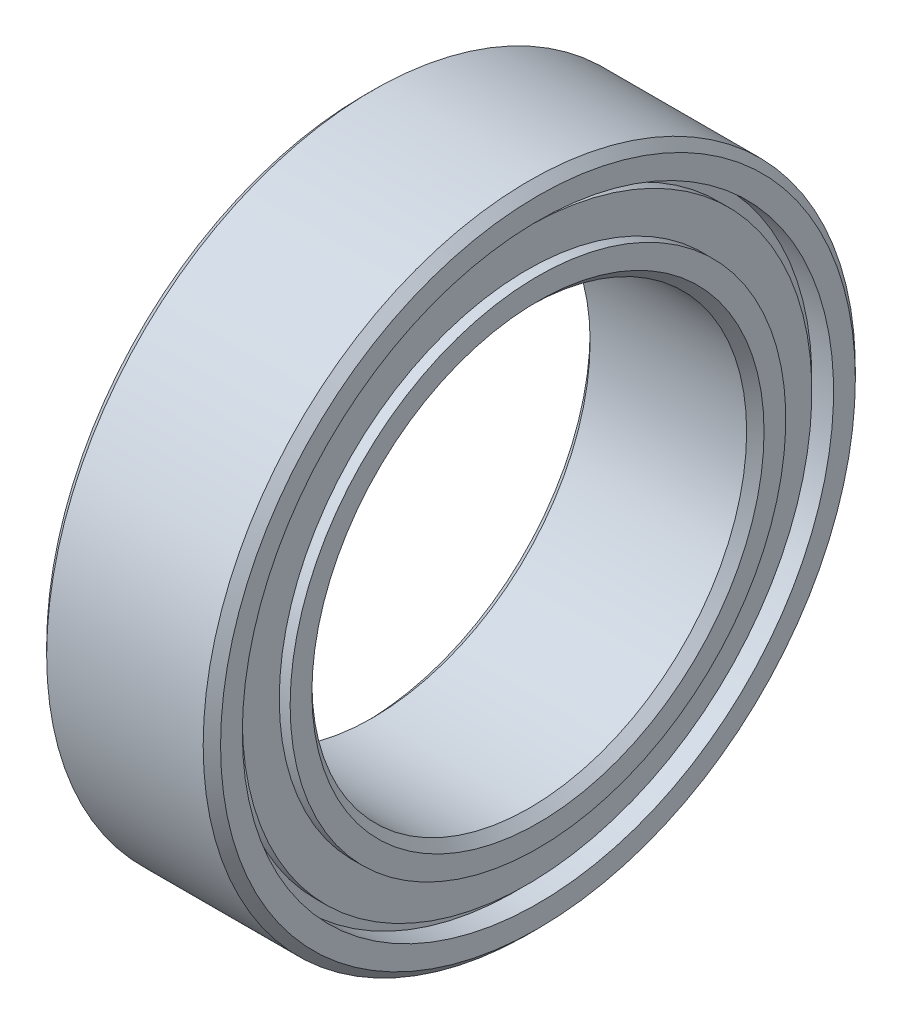
ISO-10303-21;
HEADER;
FILE_DESCRIPTION(('STEP AP214'),'2;1');
FILE_NAME('part.step','',(''),(''),'','','');
FILE_SCHEMA(('AUTOMOTIVE_DESIGN { 1 0 10303 214 1 1 1 1 }'));
ENDSEC;
DATA;
#1=APPLICATION_CONTEXT('core data for automotive mechanical design processes');
#2=APPLICATION_PROTOCOL_DEFINITION('international standard','automotive_design',2000,#1);
#3=PRODUCT_CONTEXT('',#1,'mechanical');
#4=PRODUCT('Part','Part','',(#3));
#5=PRODUCT_RELATED_PRODUCT_CATEGORY('part','',(#4));
#6=PRODUCT_DEFINITION_FORMATION('','',#4);
#7=PRODUCT_DEFINITION_CONTEXT('part definition',#1,'design');
#8=PRODUCT_DEFINITION('design','',#6,#7);
#9=PRODUCT_DEFINITION_SHAPE('','',#8);
#10=(LENGTH_UNIT() NAMED_UNIT(*) SI_UNIT(.MILLI.,.METRE.));
#11=(NAMED_UNIT(*) PLANE_ANGLE_UNIT() SI_UNIT($,.RADIAN.));
#12=(NAMED_UNIT(*) SI_UNIT($,.STERADIAN.) SOLID_ANGLE_UNIT());
#13=UNCERTAINTY_MEASURE_WITH_UNIT(LENGTH_MEASURE(1.E-05),#10,'distance_accuracy_value','');
#14=(GEOMETRIC_REPRESENTATION_CONTEXT(3) GLOBAL_UNCERTAINTY_ASSIGNED_CONTEXT((#13)) GLOBAL_UNIT_ASSIGNED_CONTEXT((#10,
#11,#12)) REPRESENTATION_CONTEXT('',''));
#15=CARTESIAN_POINT('',(0.,0.,0.));
#16=DIRECTION('',(0.,0.,1.));
#17=DIRECTION('',(1.,0.,0.));
#18=AXIS2_PLACEMENT_3D('',#15,#16,#17);
#19=CARTESIAN_POINT('',(-2.,6.8,0.));
#20=DIRECTION('',(1.,0.,0.));
#21=DIRECTION('',(0.,0.,-1.));
#22=AXIS2_PLACEMENT_3D('',#19,#20,#21);
#23=PLANE('',#22);
#24=CARTESIAN_POINT('',(-2.,0.,0.));
#25=DIRECTION('',(1.,0.,0.));
#26=DIRECTION('',(0.,0.,-1.));
#27=AXIS2_PLACEMENT_3D('',#24,#25,#26);
#28=CIRCLE('',#27,7.3);
#29=CARTESIAN_POINT('',(-2.,0.,-7.3));
#30=VERTEX_POINT('',#29);
#31=EDGE_CURVE('E10',#30,#30,#28,.F.);
#32=ORIENTED_EDGE('',*,*,#31,.T.);
#33=EDGE_LOOP('',(#32));
#34=FACE_BOUND('',#33,.T.);
#35=CARTESIAN_POINT('',(-2.,0.,0.));
#36=DIRECTION('',(-1.,0.,0.));
#37=DIRECTION('',(0.,0.,1.));
#38=AXIS2_PLACEMENT_3D('',#35,#36,#37);
#39=CIRCLE('',#38,6.8);
#40=CARTESIAN_POINT('',(-2.,0.,6.8));
#41=VERTEX_POINT('',#40);
#42=EDGE_CURVE('E68',#41,#41,#39,.T.);
#43=ORIENTED_EDGE('',*,*,#42,.F.);
#44=EDGE_LOOP('',(#43));
#45=FACE_BOUND('',#44,.T.);
#46=ADVANCED_FACE('F35',(#34,#45),#23,.F.);
#47=CARTESIAN_POINT('',(-3.90102380964335,0.,0.));
#48=DIRECTION('',(-1.,0.,0.));
#49=DIRECTION('',(0.,0.,1.));
#50=AXIS2_PLACEMENT_3D('',#47,#48,#49);
#51=CYLINDRICAL_SURFACE('',#50,6.8);
#52=CARTESIAN_POINT('',(-1.5,0.,0.));
#53=DIRECTION('',(-1.,0.,0.));
#54=DIRECTION('',(0.,0.,1.));
#55=AXIS2_PLACEMENT_3D('',#52,#53,#54);
#56=CIRCLE('',#55,6.8);
#57=CARTESIAN_POINT('',(-1.5,0.,6.8));
#58=VERTEX_POINT('',#57);
#59=EDGE_CURVE('E71',#58,#58,#56,.T.);
#60=ORIENTED_EDGE('',*,*,#59,.F.);
#61=EDGE_LOOP('',(#60));
#62=FACE_BOUND('',#61,.T.);
#63=ORIENTED_EDGE('',*,*,#42,.T.);
#64=EDGE_LOOP('',(#63));
#65=FACE_BOUND('',#64,.T.);
#66=ADVANCED_FACE('F149',(#62,#65),#51,.F.);
#67=CARTESIAN_POINT('',(-1.5,6.55,0.));
#68=DIRECTION('',(1.,0.,0.));
#69=DIRECTION('',(0.,0.,-1.));
#70=AXIS2_PLACEMENT_3D('',#67,#68,#69);
#71=PLANE('',#70);
#72=CARTESIAN_POINT('',(-1.5,0.,0.));
#73=DIRECTION('',(-1.,0.,0.));
#74=DIRECTION('',(0.,0.,1.));
#75=AXIS2_PLACEMENT_3D('',#72,#73,#74);
#76=CIRCLE('',#75,6.55);
#77=CARTESIAN_POINT('',(-1.5,0.,6.55));
#78=VERTEX_POINT('',#77);
#79=EDGE_CURVE('E74',#78,#78,#76,.T.);
#80=ORIENTED_EDGE('',*,*,#79,.F.);
#81=EDGE_LOOP('',(#80));
#82=FACE_BOUND('',#81,.T.);
#83=ORIENTED_EDGE('',*,*,#59,.T.);
#84=EDGE_LOOP('',(#83));
#85=FACE_BOUND('',#84,.T.);
#86=ADVANCED_FACE('F154',(#82,#85),#71,.F.);
#87=CARTESIAN_POINT('',(-3.90102380964335,0.,0.));
#88=DIRECTION('',(-1.,0.,0.));
#89=DIRECTION('',(0.,0.,1.));
#90=AXIS2_PLACEMENT_3D('',#87,#88,#89);
#91=CYLINDRICAL_SURFACE('',#90,6.55);
#92=CARTESIAN_POINT('',(-1.75,0.,0.));
#93=DIRECTION('',(-1.,0.,0.));
#94=DIRECTION('',(0.,0.,1.));
#95=AXIS2_PLACEMENT_3D('',#92,#93,#94);
#96=CIRCLE('',#95,6.55);
#97=CARTESIAN_POINT('',(-1.75,0.,6.55));
#98=VERTEX_POINT('',#97);
#99=EDGE_CURVE('E77',#98,#98,#96,.T.);
#100=ORIENTED_EDGE('',*,*,#99,.F.);
#101=EDGE_LOOP('',(#100));
#102=FACE_BOUND('',#101,.T.);
#103=ORIENTED_EDGE('',*,*,#79,.T.);
#104=EDGE_LOOP('',(#103));
#105=FACE_BOUND('',#104,.T.);
#106=ADVANCED_FACE('F241',(#102,#105),#91,.T.);
#107=CARTESIAN_POINT('',(-1.75,5.7,0.));
#108=DIRECTION('',(1.,0.,0.));
#109=DIRECTION('',(0.,0.,-1.));
#110=AXIS2_PLACEMENT_3D('',#107,#108,#109);
#111=PLANE('',#110);
#112=CARTESIAN_POINT('',(-1.75,0.,0.));
#113=DIRECTION('',(-1.,0.,0.));
#114=DIRECTION('',(0.,0.,1.));
#115=AXIS2_PLACEMENT_3D('',#112,#113,#114);
#116=CIRCLE('',#115,5.7);
#117=CARTESIAN_POINT('',(-1.75,0.,5.7));
#118=VERTEX_POINT('',#117);
#119=EDGE_CURVE('E80',#118,#118,#116,.T.);
#120=ORIENTED_EDGE('',*,*,#119,.F.);
#121=EDGE_LOOP('',(#120));
#122=FACE_BOUND('',#121,.T.);
#123=ORIENTED_EDGE('',*,*,#99,.T.);
#124=EDGE_LOOP('',(#123));
#125=FACE_BOUND('',#124,.T.);
#126=ADVANCED_FACE('F229',(#122,#125),#111,.F.);
#127=CARTESIAN_POINT('',(-3.90102380964335,0.,0.));
#128=DIRECTION('',(-1.,0.,0.));
#129=DIRECTION('',(0.,0.,1.));
#130=AXIS2_PLACEMENT_3D('',#127,#128,#129);
#131=CYLINDRICAL_SURFACE('',#130,5.7);
#132=CARTESIAN_POINT('',(-2.,0.,0.));
#133=DIRECTION('',(-1.,0.,0.));
#134=DIRECTION('',(0.,0.,1.));
#135=AXIS2_PLACEMENT_3D('',#132,#133,#134);
#136=CIRCLE('',#135,5.7);
#137=CARTESIAN_POINT('',(-2.,0.,5.7));
#138=VERTEX_POINT('',#137);
#139=EDGE_CURVE('E83',#138,#138,#136,.T.);
#140=ORIENTED_EDGE('',*,*,#139,.F.);
#141=EDGE_LOOP('',(#140));
#142=FACE_BOUND('',#141,.T.);
#143=ORIENTED_EDGE('',*,*,#119,.T.);
#144=EDGE_LOOP('',(#143));
#145=FACE_BOUND('',#144,.T.);
#146=ADVANCED_FACE('F224',(#142,#145),#131,.T.);
#147=CARTESIAN_POINT('',(-2.,5.,0.));
#148=DIRECTION('',(1.,0.,0.));
#149=DIRECTION('',(0.,0.,-1.));
#150=AXIS2_PLACEMENT_3D('',#147,#148,#149);
#151=PLANE('',#150);
#152=CARTESIAN_POINT('',(-2.,0.,0.));
#153=DIRECTION('',(1.,0.,0.));
#154=DIRECTION('',(0.,0.,-1.));
#155=AXIS2_PLACEMENT_3D('',#152,#153,#154);
#156=CIRCLE('',#155,5.2);
#157=CARTESIAN_POINT('',(-2.,0.,-5.2));
#158=VERTEX_POINT('',#157);
#159=EDGE_CURVE('E59',#158,#158,#156,.T.);
#160=ORIENTED_EDGE('',*,*,#159,.T.);
#161=EDGE_LOOP('',(#160));
#162=FACE_BOUND('',#161,.T.);
#163=ORIENTED_EDGE('',*,*,#139,.T.);
#164=EDGE_LOOP('',(#163));
#165=FACE_BOUND('',#164,.T.);
#166=ADVANCED_FACE('F145',(#162,#165),#151,.F.);
#167=CARTESIAN_POINT('',(-3.90102380964335,0.,0.));
#168=DIRECTION('',(-1.,0.,0.));
#169=DIRECTION('',(0.,0.,1.));
#170=AXIS2_PLACEMENT_3D('',#167,#168,#169);
#171=CYLINDRICAL_SURFACE('',#170,5.);
#172=CARTESIAN_POINT('',(-1.8,0.,0.));
#173=DIRECTION('',(1.,0.,0.));
#174=DIRECTION('',(0.,0.,-1.));
#175=AXIS2_PLACEMENT_3D('',#172,#173,#174);
#176=CIRCLE('',#175,5.);
#177=CARTESIAN_POINT('',(-1.8,0.,-5.));
#178=VERTEX_POINT('',#177);
#179=EDGE_CURVE('E62',#178,#178,#176,.F.);
#180=ORIENTED_EDGE('',*,*,#179,.T.);
#181=EDGE_LOOP('',(#180));
#182=FACE_BOUND('',#181,.T.);
#183=CARTESIAN_POINT('',(1.8,0.,0.));
#184=DIRECTION('',(-1.,0.,0.));
#185=DIRECTION('',(0.,0.,1.));
#186=AXIS2_PLACEMENT_3D('',#183,#184,#185);
#187=CIRCLE('',#186,5.);
#188=CARTESIAN_POINT('',(1.8,0.,5.));
#189=VERTEX_POINT('',#188);
#190=EDGE_CURVE('E65',#189,#189,#187,.F.);
#191=ORIENTED_EDGE('',*,*,#190,.T.);
#192=EDGE_LOOP('',(#191));
#193=FACE_BOUND('',#192,.T.);
#194=ADVANCED_FACE('F139',(#182,#193),#171,.F.);
#195=CARTESIAN_POINT('',(2.,5.,0.));
#196=DIRECTION('',(-1.,0.,0.));
#197=DIRECTION('',(0.,0.,1.));
#198=AXIS2_PLACEMENT_3D('',#195,#196,#197);
#199=PLANE('',#198);
#200=CARTESIAN_POINT('',(2.,0.,0.));
#201=DIRECTION('',(-1.,0.,0.));
#202=DIRECTION('',(0.,0.,1.));
#203=AXIS2_PLACEMENT_3D('',#200,#201,#202);
#204=CIRCLE('',#203,5.2);
#205=CARTESIAN_POINT('',(2.,0.,5.2));
#206=VERTEX_POINT('',#205);
#207=EDGE_CURVE('E56',#206,#206,#204,.T.);
#208=ORIENTED_EDGE('',*,*,#207,.T.);
#209=EDGE_LOOP('',(#208));
#210=FACE_BOUND('',#209,.T.);
#211=CARTESIAN_POINT('',(2.,0.,0.));
#212=DIRECTION('',(-1.,0.,0.));
#213=DIRECTION('',(0.,0.,1.));
#214=AXIS2_PLACEMENT_3D('',#211,#212,#213);
#215=CIRCLE('',#214,5.7);
#216=CARTESIAN_POINT('',(2.,0.,5.7));
#217=VERTEX_POINT('',#216);
#218=EDGE_CURVE('E86',#217,#217,#215,.T.);
#219=ORIENTED_EDGE('',*,*,#218,.F.);
#220=EDGE_LOOP('',(#219));
#221=FACE_BOUND('',#220,.T.);
#222=ADVANCED_FACE('F134',(#210,#221),#199,.F.);
#223=CARTESIAN_POINT('',(-3.90102380964335,0.,0.));
#224=DIRECTION('',(-1.,0.,0.));
#225=DIRECTION('',(0.,0.,1.));
#226=AXIS2_PLACEMENT_3D('',#223,#224,#225);
#227=CYLINDRICAL_SURFACE('',#226,5.7);
#228=CARTESIAN_POINT('',(1.75,0.,0.));
#229=DIRECTION('',(-1.,0.,0.));
#230=DIRECTION('',(0.,0.,1.));
#231=AXIS2_PLACEMENT_3D('',#228,#229,#230);
#232=CIRCLE('',#231,5.7);
#233=CARTESIAN_POINT('',(1.75,0.,5.7));
#234=VERTEX_POINT('',#233);
#235=EDGE_CURVE('E89',#234,#234,#232,.T.);
#236=ORIENTED_EDGE('',*,*,#235,.F.);
#237=EDGE_LOOP('',(#236));
#238=FACE_BOUND('',#237,.T.);
#239=ORIENTED_EDGE('',*,*,#218,.T.);
#240=EDGE_LOOP('',(#239));
#241=FACE_BOUND('',#240,.T.);
#242=ADVANCED_FACE('F128',(#238,#241),#227,.T.);
#243=CARTESIAN_POINT('',(1.75,5.7,0.));
#244=DIRECTION('',(-1.,0.,0.));
#245=DIRECTION('',(0.,0.,1.));
#246=AXIS2_PLACEMENT_3D('',#243,#244,#245);
#247=PLANE('',#246);
#248=CARTESIAN_POINT('',(1.75,0.,0.));
#249=DIRECTION('',(-1.,0.,0.));
#250=DIRECTION('',(0.,0.,1.));
#251=AXIS2_PLACEMENT_3D('',#248,#249,#250);
#252=CIRCLE('',#251,6.55);
#253=CARTESIAN_POINT('',(1.75,0.,6.55));
#254=VERTEX_POINT('',#253);
#255=EDGE_CURVE('E92',#254,#254,#252,.T.);
#256=ORIENTED_EDGE('',*,*,#255,.F.);
#257=EDGE_LOOP('',(#256));
#258=FACE_BOUND('',#257,.T.);
#259=ORIENTED_EDGE('',*,*,#235,.T.);
#260=EDGE_LOOP('',(#259));
#261=FACE_BOUND('',#260,.T.);
#262=ADVANCED_FACE('F122',(#258,#261),#247,.F.);
#263=CARTESIAN_POINT('',(-3.90102380964335,0.,0.));
#264=DIRECTION('',(-1.,0.,0.));
#265=DIRECTION('',(0.,0.,1.));
#266=AXIS2_PLACEMENT_3D('',#263,#264,#265);
#267=CYLINDRICAL_SURFACE('',#266,6.55);
#268=CARTESIAN_POINT('',(1.5,0.,0.));
#269=DIRECTION('',(-1.,0.,0.));
#270=DIRECTION('',(0.,0.,1.));
#271=AXIS2_PLACEMENT_3D('',#268,#269,#270);
#272=CIRCLE('',#271,6.55);
#273=CARTESIAN_POINT('',(1.5,0.,6.55));
#274=VERTEX_POINT('',#273);
#275=EDGE_CURVE('E95',#274,#274,#272,.T.);
#276=ORIENTED_EDGE('',*,*,#275,.F.);
#277=EDGE_LOOP('',(#276));
#278=FACE_BOUND('',#277,.T.);
#279=ORIENTED_EDGE('',*,*,#255,.T.);
#280=EDGE_LOOP('',(#279));
#281=FACE_BOUND('',#280,.T.);
#282=ADVANCED_FACE('F116',(#278,#281),#267,.T.);
#283=CARTESIAN_POINT('',(1.5,6.55,0.));
#284=DIRECTION('',(-1.,0.,0.));
#285=DIRECTION('',(0.,0.,1.));
#286=AXIS2_PLACEMENT_3D('',#283,#284,#285);
#287=PLANE('',#286);
#288=CARTESIAN_POINT('',(1.5,0.,0.));
#289=DIRECTION('',(-1.,0.,0.));
#290=DIRECTION('',(0.,0.,1.));
#291=AXIS2_PLACEMENT_3D('',#288,#289,#290);
#292=CIRCLE('',#291,6.8);
#293=CARTESIAN_POINT('',(1.5,0.,6.8));
#294=VERTEX_POINT('',#293);
#295=EDGE_CURVE('E98',#294,#294,#292,.T.);
#296=ORIENTED_EDGE('',*,*,#295,.F.);
#297=EDGE_LOOP('',(#296));
#298=FACE_BOUND('',#297,.T.);
#299=ORIENTED_EDGE('',*,*,#275,.T.);
#300=EDGE_LOOP('',(#299));
#301=FACE_BOUND('',#300,.T.);
#302=ADVANCED_FACE('F110',(#298,#301),#287,.F.);
#303=CARTESIAN_POINT('',(-3.90102380964335,0.,0.));
#304=DIRECTION('',(-1.,0.,0.));
#305=DIRECTION('',(0.,0.,1.));
#306=AXIS2_PLACEMENT_3D('',#303,#304,#305);
#307=CYLINDRICAL_SURFACE('',#306,6.8);
#308=CARTESIAN_POINT('',(2.,0.,0.));
#309=DIRECTION('',(-1.,0.,0.));
#310=DIRECTION('',(0.,0.,1.));
#311=AXIS2_PLACEMENT_3D('',#308,#309,#310);
#312=CIRCLE('',#311,6.8);
#313=CARTESIAN_POINT('',(2.,0.,6.8));
#314=VERTEX_POINT('',#313);
#315=EDGE_CURVE('E101',#314,#314,#312,.T.);
#316=ORIENTED_EDGE('',*,*,#315,.F.);
#317=EDGE_LOOP('',(#316));
#318=FACE_BOUND('',#317,.T.);
#319=ORIENTED_EDGE('',*,*,#295,.T.);
#320=EDGE_LOOP('',(#319));
#321=FACE_BOUND('',#320,.T.);
#322=ADVANCED_FACE('F107',(#318,#321),#307,.F.);
#323=CARTESIAN_POINT('',(2.,6.8,0.));
#324=DIRECTION('',(-1.,0.,0.));
#325=DIRECTION('',(0.,0.,1.));
#326=AXIS2_PLACEMENT_3D('',#323,#324,#325);
#327=PLANE('',#326);
#328=CARTESIAN_POINT('',(2.,0.,0.));
#329=DIRECTION('',(-1.,0.,0.));
#330=DIRECTION('',(0.,0.,1.));
#331=AXIS2_PLACEMENT_3D('',#328,#329,#330);
#332=CIRCLE('',#331,7.3);
#333=CARTESIAN_POINT('',(2.,0.,7.3));
#334=VERTEX_POINT('',#333);
#335=EDGE_CURVE('E43',#334,#334,#332,.F.);
#336=ORIENTED_EDGE('',*,*,#335,.T.);
#337=EDGE_LOOP('',(#336));
#338=FACE_BOUND('',#337,.T.);
#339=ORIENTED_EDGE('',*,*,#315,.T.);
#340=EDGE_LOOP('',(#339));
#341=FACE_BOUND('',#340,.T.);
#342=ADVANCED_FACE('F105',(#338,#341),#327,.F.);
#343=CARTESIAN_POINT('',(-3.90102380964335,0.,0.));
#344=DIRECTION('',(-1.,0.,0.));
#345=DIRECTION('',(0.,0.,1.));
#346=AXIS2_PLACEMENT_3D('',#343,#344,#345);
#347=CYLINDRICAL_SURFACE('',#346,7.5);
#348=CARTESIAN_POINT('',(1.8,0.,0.));
#349=DIRECTION('',(-1.,0.,0.));
#350=DIRECTION('',(0.,0.,1.));
#351=AXIS2_PLACEMENT_3D('',#348,#349,#350);
#352=CIRCLE('',#351,7.5);
#353=CARTESIAN_POINT('',(1.8,0.,7.5));
#354=VERTEX_POINT('',#353);
#355=EDGE_CURVE('E47',#354,#354,#352,.T.);
#356=ORIENTED_EDGE('',*,*,#355,.T.);
#357=EDGE_LOOP('',(#356));
#358=FACE_BOUND('',#357,.T.);
#359=CARTESIAN_POINT('',(-1.8,0.,0.));
#360=DIRECTION('',(1.,0.,0.));
#361=DIRECTION('',(0.,0.,-1.));
#362=AXIS2_PLACEMENT_3D('',#359,#360,#361);
#363=CIRCLE('',#362,7.5);
#364=CARTESIAN_POINT('',(-1.8,0.,-7.5));
#365=VERTEX_POINT('',#364);
#366=EDGE_CURVE('E51',#365,#365,#363,.T.);
#367=ORIENTED_EDGE('',*,*,#366,.T.);
#368=EDGE_LOOP('',(#367));
#369=FACE_BOUND('',#368,.T.);
#370=ADVANCED_FACE('F168',(#358,#369),#347,.T.);
#371=CARTESIAN_POINT('',(-1.8,0.,0.));
#372=DIRECTION('',(-1.,0.,0.));
#373=DIRECTION('',(0.,0.,1.));
#374=AXIS2_PLACEMENT_3D('',#371,#372,#373);
#375=CONICAL_SURFACE('',#374,5.,0.785398163397446);
#376=ORIENTED_EDGE('',*,*,#159,.F.);
#377=EDGE_LOOP('',(#376));
#378=FACE_BOUND('',#377,.T.);
#379=ORIENTED_EDGE('',*,*,#179,.F.);
#380=EDGE_LOOP('',(#379));
#381=FACE_BOUND('',#380,.T.);
#382=ADVANCED_FACE('F161',(#378,#381),#375,.F.);
#383=CARTESIAN_POINT('',(2.,0.,0.));
#384=DIRECTION('',(1.,0.,0.));
#385=DIRECTION('',(0.,0.,-1.));
#386=AXIS2_PLACEMENT_3D('',#383,#384,#385);
#387=CONICAL_SURFACE('',#386,5.2,0.785398163397446);
#388=ORIENTED_EDGE('',*,*,#190,.F.);
#389=EDGE_LOOP('',(#388));
#390=FACE_BOUND('',#389,.T.);
#391=ORIENTED_EDGE('',*,*,#207,.F.);
#392=EDGE_LOOP('',(#391));
#393=FACE_BOUND('',#392,.T.);
#394=ADVANCED_FACE('F167',(#390,#393),#387,.F.);
#395=CARTESIAN_POINT('',(1.8,0.,0.));
#396=DIRECTION('',(-1.,0.,0.));
#397=DIRECTION('',(0.,0.,1.));
#398=AXIS2_PLACEMENT_3D('',#395,#396,#397);
#399=CONICAL_SURFACE('',#398,7.5,0.785398163397448);
#400=ORIENTED_EDGE('',*,*,#335,.F.);
#401=EDGE_LOOP('',(#400));
#402=FACE_BOUND('',#401,.T.);
#403=ORIENTED_EDGE('',*,*,#355,.F.);
#404=EDGE_LOOP('',(#403));
#405=FACE_BOUND('',#404,.T.);
#406=ADVANCED_FACE('F174',(#402,#405),#399,.T.);
#407=CARTESIAN_POINT('',(-2.,0.,0.));
#408=DIRECTION('',(1.,0.,0.));
#409=DIRECTION('',(0.,0.,-1.));
#410=AXIS2_PLACEMENT_3D('',#407,#408,#409);
#411=CONICAL_SURFACE('',#410,7.3,0.785398163397448);
#412=ORIENTED_EDGE('',*,*,#366,.F.);
#413=EDGE_LOOP('',(#412));
#414=FACE_BOUND('',#413,.T.);
#415=ORIENTED_EDGE('',*,*,#31,.F.);
#416=EDGE_LOOP('',(#415));
#417=FACE_BOUND('',#416,.T.);
#418=ADVANCED_FACE('F38',(#414,#417),#411,.T.);
#419=CLOSED_SHELL('',(#46,#66,#86,#106,#126,#146,#166,#194,#222,#242,#262,#282,#302,#322,#342,
#370,#382,#394,#406,#418));
#420=MANIFOLD_SOLID_BREP('B2',#419);
#421=ADVANCED_BREP_SHAPE_REPRESENTATION('',(#18,#420),#14);
#422=SHAPE_DEFINITION_REPRESENTATION(#9,#421);
ENDSEC;
END-ISO-10303-21;
